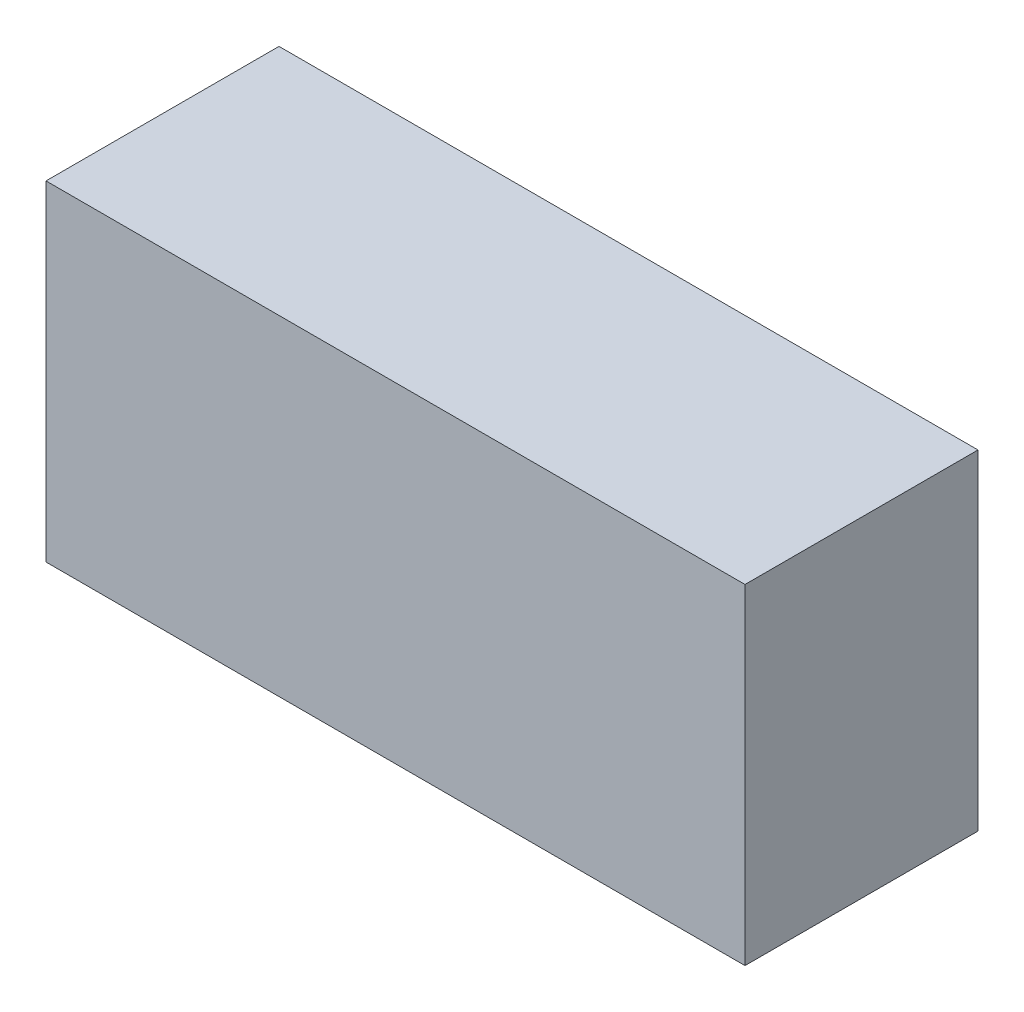
ISO-10303-21;
HEADER;
FILE_DESCRIPTION(('STEP AP214'),'2;1');
FILE_NAME('part.step','',(''),(''),'','','');
FILE_SCHEMA(('AUTOMOTIVE_DESIGN { 1 0 10303 214 1 1 1 1 }'));
ENDSEC;
DATA;
#1=APPLICATION_CONTEXT('core data for automotive mechanical design processes');
#2=APPLICATION_PROTOCOL_DEFINITION('international standard','automotive_design',2000,#1);
#3=PRODUCT_CONTEXT('',#1,'mechanical');
#4=PRODUCT('Part','Part','',(#3));
#5=PRODUCT_RELATED_PRODUCT_CATEGORY('part','',(#4));
#6=PRODUCT_DEFINITION_FORMATION('','',#4);
#7=PRODUCT_DEFINITION_CONTEXT('part definition',#1,'design');
#8=PRODUCT_DEFINITION('design','',#6,#7);
#9=PRODUCT_DEFINITION_SHAPE('','',#8);
#10=(LENGTH_UNIT() NAMED_UNIT(*) SI_UNIT(.MILLI.,.METRE.));
#11=(NAMED_UNIT(*) PLANE_ANGLE_UNIT() SI_UNIT($,.RADIAN.));
#12=(NAMED_UNIT(*) SI_UNIT($,.STERADIAN.) SOLID_ANGLE_UNIT());
#13=UNCERTAINTY_MEASURE_WITH_UNIT(LENGTH_MEASURE(1.E-05),#10,'distance_accuracy_value','');
#14=(GEOMETRIC_REPRESENTATION_CONTEXT(3) GLOBAL_UNCERTAINTY_ASSIGNED_CONTEXT((#13)) GLOBAL_UNIT_ASSIGNED_CONTEXT((#10,
#11,#12)) REPRESENTATION_CONTEXT('',''));
#15=CARTESIAN_POINT('',(0.,0.,0.));
#16=DIRECTION('',(0.,0.,1.));
#17=DIRECTION('',(1.,0.,0.));
#18=AXIS2_PLACEMENT_3D('',#15,#16,#17);
#19=CARTESIAN_POINT('',(1.15,0.,1.2));
#20=DIRECTION('',(0.,0.,1.));
#21=DIRECTION('',(1.,0.,0.));
#22=AXIS2_PLACEMENT_3D('',#19,#20,#21);
#23=PLANE('',#22);
#24=DIRECTION('',(1.,0.,0.));
#25=VECTOR('',#24,1.);
#26=CARTESIAN_POINT('',(-0.65,-0.85,1.2));
#27=LINE('',#26,#25);
#28=CARTESIAN_POINT('',(-0.65,-0.85,1.2));
#29=VERTEX_POINT('',#28);
#30=CARTESIAN_POINT('',(2.95,-0.85,1.2));
#31=VERTEX_POINT('',#30);
#32=EDGE_CURVE('E79',#29,#31,#27,.T.);
#33=ORIENTED_EDGE('',*,*,#32,.T.);
#34=DIRECTION('',(0.,1.,0.));
#35=VECTOR('',#34,1.);
#36=CARTESIAN_POINT('',(2.95,-0.85,1.2));
#37=LINE('',#36,#35);
#38=CARTESIAN_POINT('',(2.95,0.85,1.2));
#39=VERTEX_POINT('',#38);
#40=EDGE_CURVE('E77',#31,#39,#37,.T.);
#41=ORIENTED_EDGE('',*,*,#40,.T.);
#42=DIRECTION('',(-1.,0.,0.));
#43=VECTOR('',#42,1.);
#44=CARTESIAN_POINT('',(2.95,0.85,1.2));
#45=LINE('',#44,#43);
#46=CARTESIAN_POINT('',(-0.65,0.85,1.2));
#47=VERTEX_POINT('',#46);
#48=EDGE_CURVE('E66',#39,#47,#45,.T.);
#49=ORIENTED_EDGE('',*,*,#48,.T.);
#50=DIRECTION('',(0.,-1.,0.));
#51=VECTOR('',#50,1.);
#52=CARTESIAN_POINT('',(-0.65,0.85,1.2));
#53=LINE('',#52,#51);
#54=EDGE_CURVE('E11',#47,#29,#53,.T.);
#55=ORIENTED_EDGE('',*,*,#54,.T.);
#56=EDGE_LOOP('',(#33,#41,#49,#55));
#57=FACE_BOUND('',#56,.T.);
#58=ADVANCED_FACE('F16',(#57),#23,.T.);
#59=CARTESIAN_POINT('',(1.15,0.,0.));
#60=DIRECTION('',(0.,0.,1.));
#61=DIRECTION('',(1.,0.,0.));
#62=AXIS2_PLACEMENT_3D('',#59,#60,#61);
#63=PLANE('',#62);
#64=DIRECTION('',(1.,0.,0.));
#65=VECTOR('',#64,1.);
#66=CARTESIAN_POINT('',(-0.65,-0.85,0.));
#67=LINE('',#66,#65);
#68=CARTESIAN_POINT('',(-0.65,-0.85,0.));
#69=VERTEX_POINT('',#68);
#70=CARTESIAN_POINT('',(2.95,-0.85,0.));
#71=VERTEX_POINT('',#70);
#72=EDGE_CURVE('E97',#69,#71,#67,.T.);
#73=ORIENTED_EDGE('',*,*,#72,.F.);
#74=DIRECTION('',(0.,-1.,0.));
#75=VECTOR('',#74,1.);
#76=CARTESIAN_POINT('',(-0.65,0.85,0.));
#77=LINE('',#76,#75);
#78=CARTESIAN_POINT('',(-0.65,0.85,0.));
#79=VERTEX_POINT('',#78);
#80=EDGE_CURVE('E27',#79,#69,#77,.T.);
#81=ORIENTED_EDGE('',*,*,#80,.F.);
#82=DIRECTION('',(-1.,0.,0.));
#83=VECTOR('',#82,1.);
#84=CARTESIAN_POINT('',(2.95,0.85,0.));
#85=LINE('',#84,#83);
#86=CARTESIAN_POINT('',(2.95,0.85,0.));
#87=VERTEX_POINT('',#86);
#88=EDGE_CURVE('E84',#87,#79,#85,.T.);
#89=ORIENTED_EDGE('',*,*,#88,.F.);
#90=DIRECTION('',(0.,1.,0.));
#91=VECTOR('',#90,1.);
#92=CARTESIAN_POINT('',(2.95,-0.85,0.));
#93=LINE('',#92,#91);
#94=EDGE_CURVE('E87',#71,#87,#93,.T.);
#95=ORIENTED_EDGE('',*,*,#94,.F.);
#96=EDGE_LOOP('',(#73,#81,#89,#95));
#97=FACE_BOUND('',#96,.T.);
#98=ADVANCED_FACE('F164',(#97),#63,.F.);
#99=CARTESIAN_POINT('',(-0.65,0.85,0.));
#100=DIRECTION('',(1.,0.,0.));
#101=DIRECTION('',(0.,1.,0.));
#102=AXIS2_PLACEMENT_3D('',#99,#100,#101);
#103=PLANE('',#102);
#104=DIRECTION('',(0.,0.,1.));
#105=VECTOR('',#104,1.);
#106=CARTESIAN_POINT('',(-0.65,0.85,0.));
#107=LINE('',#106,#105);
#108=EDGE_CURVE('E72',#79,#47,#107,.T.);
#109=ORIENTED_EDGE('',*,*,#108,.F.);
#110=ORIENTED_EDGE('',*,*,#80,.T.);
#111=DIRECTION('',(0.,0.,1.));
#112=VECTOR('',#111,1.);
#113=CARTESIAN_POINT('',(-0.65,-0.85,0.));
#114=LINE('',#113,#112);
#115=EDGE_CURVE('E20',#69,#29,#114,.T.);
#116=ORIENTED_EDGE('',*,*,#115,.T.);
#117=ORIENTED_EDGE('',*,*,#54,.F.);
#118=EDGE_LOOP('',(#109,#110,#116,#117));
#119=FACE_BOUND('',#118,.T.);
#120=ADVANCED_FACE('F117',(#119),#103,.F.);
#121=CARTESIAN_POINT('',(2.95,0.85,0.));
#122=DIRECTION('',(0.,-1.,0.));
#123=DIRECTION('',(0.,0.,-1.));
#124=AXIS2_PLACEMENT_3D('',#121,#122,#123);
#125=PLANE('',#124);
#126=DIRECTION('',(0.,0.,1.));
#127=VECTOR('',#126,1.);
#128=CARTESIAN_POINT('',(2.95,0.85,0.));
#129=LINE('',#128,#127);
#130=EDGE_CURVE('E70',#87,#39,#129,.T.);
#131=ORIENTED_EDGE('',*,*,#130,.F.);
#132=ORIENTED_EDGE('',*,*,#88,.T.);
#133=ORIENTED_EDGE('',*,*,#108,.T.);
#134=ORIENTED_EDGE('',*,*,#48,.F.);
#135=EDGE_LOOP('',(#131,#132,#133,#134));
#136=FACE_BOUND('',#135,.T.);
#137=ADVANCED_FACE('F18',(#136),#125,.F.);
#138=CARTESIAN_POINT('',(2.95,-0.85,0.));
#139=DIRECTION('',(-1.,0.,0.));
#140=DIRECTION('',(0.,0.,1.));
#141=AXIS2_PLACEMENT_3D('',#138,#139,#140);
#142=PLANE('',#141);
#143=DIRECTION('',(0.,0.,1.));
#144=VECTOR('',#143,1.);
#145=CARTESIAN_POINT('',(2.95,-0.85,0.));
#146=LINE('',#145,#144);
#147=EDGE_CURVE('E105',#71,#31,#146,.T.);
#148=ORIENTED_EDGE('',*,*,#147,.F.);
#149=ORIENTED_EDGE('',*,*,#94,.T.);
#150=ORIENTED_EDGE('',*,*,#130,.T.);
#151=ORIENTED_EDGE('',*,*,#40,.F.);
#152=EDGE_LOOP('',(#148,#149,#150,#151));
#153=FACE_BOUND('',#152,.T.);
#154=ADVANCED_FACE('F86',(#153),#142,.F.);
#155=CARTESIAN_POINT('',(-0.65,-0.85,0.));
#156=DIRECTION('',(0.,1.,0.));
#157=DIRECTION('',(1.,0.,0.));
#158=AXIS2_PLACEMENT_3D('',#155,#156,#157);
#159=PLANE('',#158);
#160=ORIENTED_EDGE('',*,*,#115,.F.);
#161=ORIENTED_EDGE('',*,*,#72,.T.);
#162=ORIENTED_EDGE('',*,*,#147,.T.);
#163=ORIENTED_EDGE('',*,*,#32,.F.);
#164=EDGE_LOOP('',(#160,#161,#162,#163));
#165=FACE_BOUND('',#164,.T.);
#166=ADVANCED_FACE('F118',(#165),#159,.F.);
#167=CLOSED_SHELL('',(#58,#98,#120,#137,#154,#166));
#168=MANIFOLD_SOLID_BREP('B1',#167);
#169=ADVANCED_BREP_SHAPE_REPRESENTATION('',(#18,#168),#14);
#170=SHAPE_DEFINITION_REPRESENTATION(#9,#169);
ENDSEC;
END-ISO-10303-21;
